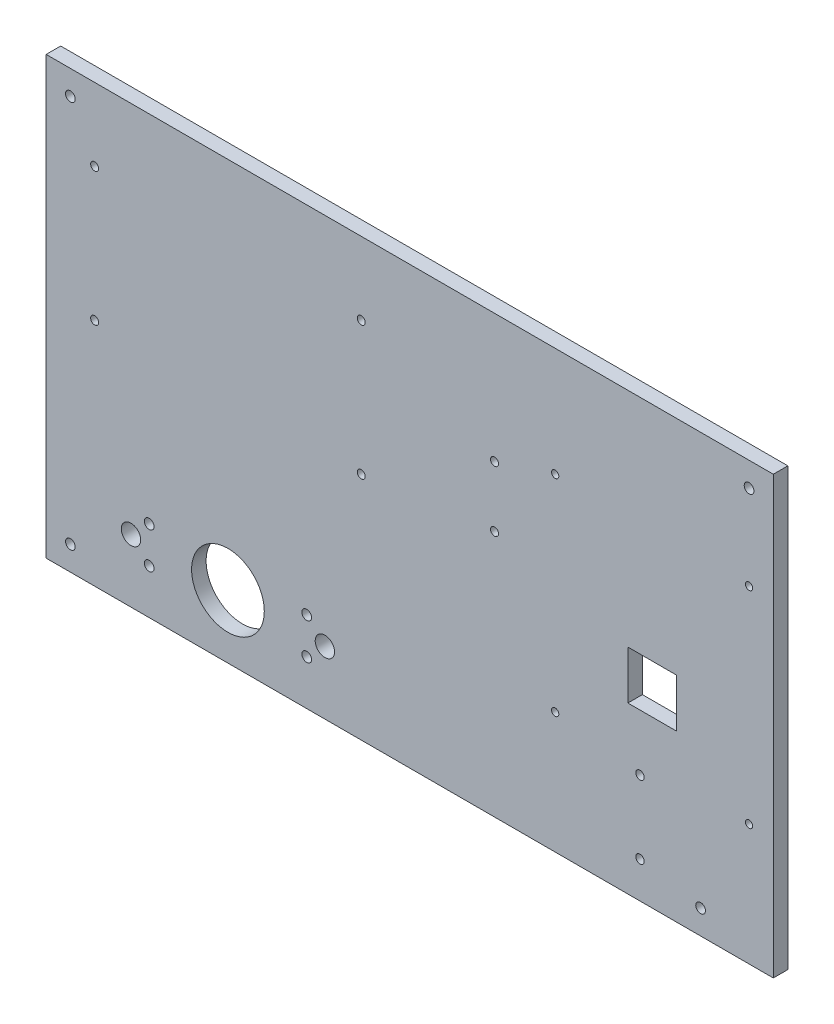
ISO-10303-21;
HEADER;
FILE_DESCRIPTION(('STEP AP214'),'2;1');
FILE_NAME('part.step','',(''),(''),'','','');
FILE_SCHEMA(('AUTOMOTIVE_DESIGN { 1 0 10303 214 1 1 1 1 }'));
ENDSEC;
DATA;
#1=APPLICATION_CONTEXT('core data for automotive mechanical design processes');
#2=APPLICATION_PROTOCOL_DEFINITION('international standard','automotive_design',2000,#1);
#3=PRODUCT_CONTEXT('',#1,'mechanical');
#4=PRODUCT('Part','Part','',(#3));
#5=PRODUCT_RELATED_PRODUCT_CATEGORY('part','',(#4));
#6=PRODUCT_DEFINITION_FORMATION('','',#4);
#7=PRODUCT_DEFINITION_CONTEXT('part definition',#1,'design');
#8=PRODUCT_DEFINITION('design','',#6,#7);
#9=PRODUCT_DEFINITION_SHAPE('','',#8);
#10=(LENGTH_UNIT() NAMED_UNIT(*) SI_UNIT(.MILLI.,.METRE.));
#11=(NAMED_UNIT(*) PLANE_ANGLE_UNIT() SI_UNIT($,.RADIAN.));
#12=(NAMED_UNIT(*) SI_UNIT($,.STERADIAN.) SOLID_ANGLE_UNIT());
#13=UNCERTAINTY_MEASURE_WITH_UNIT(LENGTH_MEASURE(1.E-05),#10,'distance_accuracy_value','');
#14=(GEOMETRIC_REPRESENTATION_CONTEXT(3) GLOBAL_UNCERTAINTY_ASSIGNED_CONTEXT((#13)) GLOBAL_UNIT_ASSIGNED_CONTEXT((#10,
#11,#12)) REPRESENTATION_CONTEXT('',''));
#15=CARTESIAN_POINT('',(0.,0.,0.));
#16=DIRECTION('',(0.,0.,1.));
#17=DIRECTION('',(1.,0.,0.));
#18=AXIS2_PLACEMENT_3D('',#15,#16,#17);
#19=CARTESIAN_POINT('',(0.,-1.75000000000004,6.));
#20=DIRECTION('',(0.,1.,0.));
#21=DIRECTION('',(0.,0.,1.));
#22=AXIS2_PLACEMENT_3D('',#19,#20,#21);
#23=PLANE('',#22);
#24=DIRECTION('',(1.,0.,0.));
#25=VECTOR('',#24,1.);
#26=CARTESIAN_POINT('',(0.,-1.75000000000004,0.));
#27=LINE('',#26,#25);
#28=CARTESIAN_POINT('',(90.,-1.75000000000004,0.));
#29=VERTEX_POINT('',#28);
#30=CARTESIAN_POINT('',(110.,-1.75000000000004,0.));
#31=VERTEX_POINT('',#30);
#32=EDGE_CURVE('E205',#29,#31,#27,.T.);
#33=ORIENTED_EDGE('',*,*,#32,.T.);
#34=DIRECTION('',(0.,0.,-1.));
#35=VECTOR('',#34,1.);
#36=CARTESIAN_POINT('',(110.,-1.75000000000004,6.));
#37=LINE('',#36,#35);
#38=CARTESIAN_POINT('',(110.,-1.75000000000004,6.));
#39=VERTEX_POINT('',#38);
#40=EDGE_CURVE('E11',#39,#31,#37,.T.);
#41=ORIENTED_EDGE('',*,*,#40,.F.);
#42=DIRECTION('',(1.,0.,0.));
#43=VECTOR('',#42,1.);
#44=CARTESIAN_POINT('',(0.,-1.75000000000004,6.));
#45=LINE('',#44,#43);
#46=CARTESIAN_POINT('',(90.,-1.75000000000004,6.));
#47=VERTEX_POINT('',#46);
#48=EDGE_CURVE('E118',#47,#39,#45,.T.);
#49=ORIENTED_EDGE('',*,*,#48,.F.);
#50=DIRECTION('',(0.,0.,-1.));
#51=VECTOR('',#50,1.);
#52=CARTESIAN_POINT('',(90.,-1.75000000000004,6.));
#53=LINE('',#52,#51);
#54=EDGE_CURVE('E56',#47,#29,#53,.T.);
#55=ORIENTED_EDGE('',*,*,#54,.T.);
#56=EDGE_LOOP('',(#33,#41,#49,#55));
#57=FACE_BOUND('',#56,.T.);
#58=ADVANCED_FACE('F37',(#57),#23,.F.);
#59=CARTESIAN_POINT('',(110.,0.,6.));
#60=DIRECTION('',(1.,0.,0.));
#61=DIRECTION('',(0.,0.,-1.));
#62=AXIS2_PLACEMENT_3D('',#59,#60,#61);
#63=PLANE('',#62);
#64=DIRECTION('',(0.,-1.,0.));
#65=VECTOR('',#64,1.);
#66=CARTESIAN_POINT('',(110.,0.,0.));
#67=LINE('',#66,#65);
#68=CARTESIAN_POINT('',(110.,-21.75,0.));
#69=VERTEX_POINT('',#68);
#70=EDGE_CURVE('E124',#31,#69,#67,.T.);
#71=ORIENTED_EDGE('',*,*,#70,.T.);
#72=DIRECTION('',(0.,0.,-1.));
#73=VECTOR('',#72,1.);
#74=CARTESIAN_POINT('',(110.,-21.75,6.));
#75=LINE('',#74,#73);
#76=CARTESIAN_POINT('',(110.,-21.75,6.));
#77=VERTEX_POINT('',#76);
#78=EDGE_CURVE('E47',#77,#69,#75,.T.);
#79=ORIENTED_EDGE('',*,*,#78,.F.);
#80=DIRECTION('',(0.,-1.,0.));
#81=VECTOR('',#80,1.);
#82=CARTESIAN_POINT('',(110.,0.,6.));
#83=LINE('',#82,#81);
#84=EDGE_CURVE('E111',#39,#77,#83,.T.);
#85=ORIENTED_EDGE('',*,*,#84,.F.);
#86=ORIENTED_EDGE('',*,*,#40,.T.);
#87=EDGE_LOOP('',(#71,#79,#85,#86));
#88=FACE_BOUND('',#87,.T.);
#89=ADVANCED_FACE('F123',(#88),#63,.F.);
#90=CARTESIAN_POINT('',(0.,-21.75,6.));
#91=DIRECTION('',(0.,1.,0.));
#92=DIRECTION('',(0.,0.,1.));
#93=AXIS2_PLACEMENT_3D('',#90,#91,#92);
#94=PLANE('',#93);
#95=DIRECTION('',(1.,0.,0.));
#96=VECTOR('',#95,1.);
#97=CARTESIAN_POINT('',(0.,-21.75,0.));
#98=LINE('',#97,#96);
#99=CARTESIAN_POINT('',(90.,-21.75,0.));
#100=VERTEX_POINT('',#99);
#101=EDGE_CURVE('E208',#100,#69,#98,.T.);
#102=ORIENTED_EDGE('',*,*,#101,.F.);
#103=DIRECTION('',(0.,0.,-1.));
#104=VECTOR('',#103,1.);
#105=CARTESIAN_POINT('',(90.,-21.75,6.));
#106=LINE('',#105,#104);
#107=CARTESIAN_POINT('',(90.,-21.75,6.));
#108=VERTEX_POINT('',#107);
#109=EDGE_CURVE('E82',#108,#100,#106,.T.);
#110=ORIENTED_EDGE('',*,*,#109,.F.);
#111=DIRECTION('',(1.,0.,0.));
#112=VECTOR('',#111,1.);
#113=CARTESIAN_POINT('',(0.,-21.75,6.));
#114=LINE('',#113,#112);
#115=EDGE_CURVE('E117',#108,#77,#114,.T.);
#116=ORIENTED_EDGE('',*,*,#115,.T.);
#117=ORIENTED_EDGE('',*,*,#78,.T.);
#118=EDGE_LOOP('',(#102,#110,#116,#117));
#119=FACE_BOUND('',#118,.T.);
#120=ADVANCED_FACE('F128',(#119),#94,.T.);
#121=CARTESIAN_POINT('',(150.,0.,6.));
#122=DIRECTION('',(1.,0.,0.));
#123=DIRECTION('',(0.,1.,0.));
#124=AXIS2_PLACEMENT_3D('',#121,#122,#123);
#125=PLANE('',#124);
#126=DIRECTION('',(0.,-1.,0.));
#127=VECTOR('',#126,1.);
#128=CARTESIAN_POINT('',(150.,0.,0.));
#129=LINE('',#128,#127);
#130=CARTESIAN_POINT('',(150.,89.9999999999999,0.));
#131=VERTEX_POINT('',#130);
#132=CARTESIAN_POINT('',(150.,-89.9999999999999,0.));
#133=VERTEX_POINT('',#132);
#134=EDGE_CURVE('E193',#131,#133,#129,.T.);
#135=ORIENTED_EDGE('',*,*,#134,.F.);
#136=DIRECTION('',(0.,0.,-1.));
#137=VECTOR('',#136,1.);
#138=CARTESIAN_POINT('',(150.,89.9999999999999,6.));
#139=LINE('',#138,#137);
#140=CARTESIAN_POINT('',(150.,89.9999999999999,6.));
#141=VERTEX_POINT('',#140);
#142=EDGE_CURVE('E94',#141,#131,#139,.T.);
#143=ORIENTED_EDGE('',*,*,#142,.F.);
#144=DIRECTION('',(0.,-1.,0.));
#145=VECTOR('',#144,1.);
#146=CARTESIAN_POINT('',(150.,0.,6.));
#147=LINE('',#146,#145);
#148=CARTESIAN_POINT('',(150.,-89.9999999999999,6.));
#149=VERTEX_POINT('',#148);
#150=EDGE_CURVE('E300',#141,#149,#147,.T.);
#151=ORIENTED_EDGE('',*,*,#150,.T.);
#152=DIRECTION('',(0.,0.,-1.));
#153=VECTOR('',#152,1.);
#154=CARTESIAN_POINT('',(150.,-89.9999999999999,6.));
#155=LINE('',#154,#153);
#156=EDGE_CURVE('E137',#149,#133,#155,.T.);
#157=ORIENTED_EDGE('',*,*,#156,.T.);
#158=EDGE_LOOP('',(#135,#143,#151,#157));
#159=FACE_BOUND('',#158,.T.);
#160=ADVANCED_FACE('F316',(#159),#125,.T.);
#161=CARTESIAN_POINT('',(0.,90.,6.));
#162=DIRECTION('',(0.,1.,0.));
#163=DIRECTION('',(-1.,0.,0.));
#164=AXIS2_PLACEMENT_3D('',#161,#162,#163);
#165=PLANE('',#164);
#166=DIRECTION('',(1.,0.,0.));
#167=VECTOR('',#166,1.);
#168=CARTESIAN_POINT('',(0.,90.,0.));
#169=LINE('',#168,#167);
#170=CARTESIAN_POINT('',(-150.,90.,0.));
#171=VERTEX_POINT('',#170);
#172=EDGE_CURVE('E196',#171,#131,#169,.T.);
#173=ORIENTED_EDGE('',*,*,#172,.F.);
#174=DIRECTION('',(0.,0.,-1.));
#175=VECTOR('',#174,1.);
#176=CARTESIAN_POINT('',(-150.,90.,6.));
#177=LINE('',#176,#175);
#178=CARTESIAN_POINT('',(-150.,90.,6.));
#179=VERTEX_POINT('',#178);
#180=EDGE_CURVE('E223',#179,#171,#177,.T.);
#181=ORIENTED_EDGE('',*,*,#180,.F.);
#182=DIRECTION('',(1.,0.,0.));
#183=VECTOR('',#182,1.);
#184=CARTESIAN_POINT('',(0.,90.,6.));
#185=LINE('',#184,#183);
#186=EDGE_CURVE('E302',#179,#141,#185,.T.);
#187=ORIENTED_EDGE('',*,*,#186,.T.);
#188=ORIENTED_EDGE('',*,*,#142,.T.);
#189=EDGE_LOOP('',(#173,#181,#187,#188));
#190=FACE_BOUND('',#189,.T.);
#191=ADVANCED_FACE('F318',(#190),#165,.T.);
#192=CARTESIAN_POINT('',(-150.,0.,6.));
#193=DIRECTION('',(1.,0.,0.));
#194=DIRECTION('',(0.,1.,0.));
#195=AXIS2_PLACEMENT_3D('',#192,#193,#194);
#196=PLANE('',#195);
#197=DIRECTION('',(0.,-1.,0.));
#198=VECTOR('',#197,1.);
#199=CARTESIAN_POINT('',(-150.,0.,0.));
#200=LINE('',#199,#198);
#201=CARTESIAN_POINT('',(-150.,-90.,0.));
#202=VERTEX_POINT('',#201);
#203=EDGE_CURVE('E199',#171,#202,#200,.T.);
#204=ORIENTED_EDGE('',*,*,#203,.T.);
#205=DIRECTION('',(0.,0.,-1.));
#206=VECTOR('',#205,1.);
#207=CARTESIAN_POINT('',(-150.,-90.,6.));
#208=LINE('',#207,#206);
#209=CARTESIAN_POINT('',(-150.,-90.,6.));
#210=VERTEX_POINT('',#209);
#211=EDGE_CURVE('E220',#210,#202,#208,.T.);
#212=ORIENTED_EDGE('',*,*,#211,.F.);
#213=DIRECTION('',(0.,-1.,0.));
#214=VECTOR('',#213,1.);
#215=CARTESIAN_POINT('',(-150.,0.,6.));
#216=LINE('',#215,#214);
#217=EDGE_CURVE('E305',#179,#210,#216,.T.);
#218=ORIENTED_EDGE('',*,*,#217,.F.);
#219=ORIENTED_EDGE('',*,*,#180,.T.);
#220=EDGE_LOOP('',(#204,#212,#218,#219));
#221=FACE_BOUND('',#220,.T.);
#222=ADVANCED_FACE('F324',(#221),#196,.F.);
#223=CARTESIAN_POINT('',(90.,0.,6.));
#224=DIRECTION('',(1.,0.,0.));
#225=DIRECTION('',(0.,0.,-1.));
#226=AXIS2_PLACEMENT_3D('',#223,#224,#225);
#227=PLANE('',#226);
#228=DIRECTION('',(0.,-1.,0.));
#229=VECTOR('',#228,1.);
#230=CARTESIAN_POINT('',(90.,0.,0.));
#231=LINE('',#230,#229);
#232=EDGE_CURVE('E210',#29,#100,#231,.T.);
#233=ORIENTED_EDGE('',*,*,#232,.F.);
#234=ORIENTED_EDGE('',*,*,#54,.F.);
#235=DIRECTION('',(0.,-1.,0.));
#236=VECTOR('',#235,1.);
#237=CARTESIAN_POINT('',(90.,0.,6.));
#238=LINE('',#237,#236);
#239=EDGE_CURVE('E129',#47,#108,#238,.T.);
#240=ORIENTED_EDGE('',*,*,#239,.T.);
#241=ORIENTED_EDGE('',*,*,#109,.T.);
#242=EDGE_LOOP('',(#233,#234,#240,#241));
#243=FACE_BOUND('',#242,.T.);
#244=ADVANCED_FACE('F339',(#243),#227,.T.);
#245=CARTESIAN_POINT('',(0.,-90.,6.));
#246=DIRECTION('',(0.,1.,0.));
#247=DIRECTION('',(-1.,0.,0.));
#248=AXIS2_PLACEMENT_3D('',#245,#246,#247);
#249=PLANE('',#248);
#250=DIRECTION('',(1.,0.,0.));
#251=VECTOR('',#250,1.);
#252=CARTESIAN_POINT('',(0.,-90.,0.));
#253=LINE('',#252,#251);
#254=EDGE_CURVE('E202',#202,#133,#253,.T.);
#255=ORIENTED_EDGE('',*,*,#254,.T.);
#256=ORIENTED_EDGE('',*,*,#156,.F.);
#257=DIRECTION('',(1.,0.,0.));
#258=VECTOR('',#257,1.);
#259=CARTESIAN_POINT('',(0.,-90.,6.));
#260=LINE('',#259,#258);
#261=EDGE_CURVE('E308',#210,#149,#260,.T.);
#262=ORIENTED_EDGE('',*,*,#261,.F.);
#263=ORIENTED_EDGE('',*,*,#211,.T.);
#264=EDGE_LOOP('',(#255,#256,#262,#263));
#265=FACE_BOUND('',#264,.T.);
#266=ADVANCED_FACE('F315',(#265),#249,.F.);
#267=CARTESIAN_POINT('',(140.,45.,6.));
#268=DIRECTION('',(0.,0.,-1.));
#269=DIRECTION('',(-1.,0.,0.));
#270=AXIS2_PLACEMENT_3D('',#267,#268,#269);
#271=CYLINDRICAL_SURFACE('',#270,1.5);
#272=CARTESIAN_POINT('',(140.,45.,6.));
#273=DIRECTION('',(0.,0.,1.));
#274=DIRECTION('',(1.,0.,0.));
#275=AXIS2_PLACEMENT_3D('',#272,#273,#274);
#276=CIRCLE('',#275,1.5);
#277=CARTESIAN_POINT('',(141.5,45.,6.));
#278=VERTEX_POINT('',#277);
#279=EDGE_CURVE('E297',#278,#278,#276,.T.);
#280=ORIENTED_EDGE('',*,*,#279,.T.);
#281=EDGE_LOOP('',(#280));
#282=FACE_BOUND('',#281,.T.);
#283=CARTESIAN_POINT('',(140.,45.,0.));
#284=DIRECTION('',(0.,0.,1.));
#285=DIRECTION('',(1.,0.,0.));
#286=AXIS2_PLACEMENT_3D('',#283,#284,#285);
#287=CIRCLE('',#286,1.5);
#288=CARTESIAN_POINT('',(141.5,45.,0.));
#289=VERTEX_POINT('',#288);
#290=EDGE_CURVE('E190',#289,#289,#287,.T.);
#291=ORIENTED_EDGE('',*,*,#290,.F.);
#292=EDGE_LOOP('',(#291));
#293=FACE_BOUND('',#292,.T.);
#294=ADVANCED_FACE('F338',(#282,#293),#271,.F.);
#295=CARTESIAN_POINT('',(140.,-40.,6.));
#296=DIRECTION('',(0.,0.,-1.));
#297=DIRECTION('',(-1.,0.,0.));
#298=AXIS2_PLACEMENT_3D('',#295,#296,#297);
#299=CYLINDRICAL_SURFACE('',#298,1.5);
#300=CARTESIAN_POINT('',(140.,-40.,6.));
#301=DIRECTION('',(0.,0.,1.));
#302=DIRECTION('',(1.,0.,0.));
#303=AXIS2_PLACEMENT_3D('',#300,#301,#302);
#304=CIRCLE('',#303,1.5);
#305=CARTESIAN_POINT('',(141.5,-40.,6.));
#306=VERTEX_POINT('',#305);
#307=EDGE_CURVE('E294',#306,#306,#304,.F.);
#308=ORIENTED_EDGE('',*,*,#307,.F.);
#309=EDGE_LOOP('',(#308));
#310=FACE_BOUND('',#309,.T.);
#311=CARTESIAN_POINT('',(140.,-40.,0.));
#312=DIRECTION('',(0.,0.,1.));
#313=DIRECTION('',(1.,0.,0.));
#314=AXIS2_PLACEMENT_3D('',#311,#312,#313);
#315=CIRCLE('',#314,1.5);
#316=CARTESIAN_POINT('',(141.5,-40.,0.));
#317=VERTEX_POINT('',#316);
#318=EDGE_CURVE('E187',#317,#317,#315,.F.);
#319=ORIENTED_EDGE('',*,*,#318,.T.);
#320=EDGE_LOOP('',(#319));
#321=FACE_BOUND('',#320,.T.);
#322=ADVANCED_FACE('F437',(#310,#321),#299,.F.);
#323=CARTESIAN_POINT('',(60.,45.,6.));
#324=DIRECTION('',(0.,0.,-1.));
#325=DIRECTION('',(-1.,0.,0.));
#326=AXIS2_PLACEMENT_3D('',#323,#324,#325);
#327=CYLINDRICAL_SURFACE('',#326,1.5);
#328=CARTESIAN_POINT('',(60.,45.,6.));
#329=DIRECTION('',(0.,0.,1.));
#330=DIRECTION('',(1.,0.,0.));
#331=AXIS2_PLACEMENT_3D('',#328,#329,#330);
#332=CIRCLE('',#331,1.5);
#333=CARTESIAN_POINT('',(61.5,45.,6.));
#334=VERTEX_POINT('',#333);
#335=EDGE_CURVE('E291',#334,#334,#332,.T.);
#336=ORIENTED_EDGE('',*,*,#335,.T.);
#337=EDGE_LOOP('',(#336));
#338=FACE_BOUND('',#337,.T.);
#339=CARTESIAN_POINT('',(60.,45.,0.));
#340=DIRECTION('',(0.,0.,1.));
#341=DIRECTION('',(1.,0.,0.));
#342=AXIS2_PLACEMENT_3D('',#339,#340,#341);
#343=CIRCLE('',#342,1.5);
#344=CARTESIAN_POINT('',(61.5,45.,0.));
#345=VERTEX_POINT('',#344);
#346=EDGE_CURVE('E184',#345,#345,#343,.T.);
#347=ORIENTED_EDGE('',*,*,#346,.F.);
#348=EDGE_LOOP('',(#347));
#349=FACE_BOUND('',#348,.T.);
#350=ADVANCED_FACE('F443',(#338,#349),#327,.F.);
#351=CARTESIAN_POINT('',(-107.5,-56.5,6.));
#352=DIRECTION('',(0.,0.,-1.));
#353=DIRECTION('',(-1.,0.,0.));
#354=AXIS2_PLACEMENT_3D('',#351,#352,#353);
#355=CYLINDRICAL_SURFACE('',#354,2.);
#356=CARTESIAN_POINT('',(-107.5,-56.5,6.));
#357=DIRECTION('',(0.,0.,1.));
#358=DIRECTION('',(1.,0.,0.));
#359=AXIS2_PLACEMENT_3D('',#356,#357,#358);
#360=CIRCLE('',#359,2.);
#361=CARTESIAN_POINT('',(-105.5,-56.5,6.));
#362=VERTEX_POINT('',#361);
#363=EDGE_CURVE('E288',#362,#362,#360,.T.);
#364=ORIENTED_EDGE('',*,*,#363,.T.);
#365=EDGE_LOOP('',(#364));
#366=FACE_BOUND('',#365,.T.);
#367=CARTESIAN_POINT('',(-107.5,-56.5,0.));
#368=DIRECTION('',(0.,0.,1.));
#369=DIRECTION('',(1.,0.,0.));
#370=AXIS2_PLACEMENT_3D('',#367,#368,#369);
#371=CIRCLE('',#370,2.);
#372=CARTESIAN_POINT('',(-105.5,-56.5,0.));
#373=VERTEX_POINT('',#372);
#374=EDGE_CURVE('E181',#373,#373,#371,.T.);
#375=ORIENTED_EDGE('',*,*,#374,.F.);
#376=EDGE_LOOP('',(#375));
#377=FACE_BOUND('',#376,.T.);
#378=ADVANCED_FACE('F449',(#366,#377),#355,.F.);
#379=CARTESIAN_POINT('',(-42.4999999999999,-56.5,6.));
#380=DIRECTION('',(0.,0.,-1.));
#381=DIRECTION('',(-1.,0.,0.));
#382=AXIS2_PLACEMENT_3D('',#379,#380,#381);
#383=CYLINDRICAL_SURFACE('',#382,2.);
#384=CARTESIAN_POINT('',(-42.4999999999999,-56.5,6.));
#385=DIRECTION('',(0.,0.,1.));
#386=DIRECTION('',(1.,0.,0.));
#387=AXIS2_PLACEMENT_3D('',#384,#385,#386);
#388=CIRCLE('',#387,2.);
#389=CARTESIAN_POINT('',(-40.4999999999999,-56.5,6.));
#390=VERTEX_POINT('',#389);
#391=EDGE_CURVE('E285',#390,#390,#388,.T.);
#392=ORIENTED_EDGE('',*,*,#391,.T.);
#393=EDGE_LOOP('',(#392));
#394=FACE_BOUND('',#393,.T.);
#395=CARTESIAN_POINT('',(-42.4999999999999,-56.5,0.));
#396=DIRECTION('',(0.,0.,1.));
#397=DIRECTION('',(1.,0.,0.));
#398=AXIS2_PLACEMENT_3D('',#395,#396,#397);
#399=CIRCLE('',#398,2.);
#400=CARTESIAN_POINT('',(-40.4999999999999,-56.5,0.));
#401=VERTEX_POINT('',#400);
#402=EDGE_CURVE('E178',#401,#401,#399,.T.);
#403=ORIENTED_EDGE('',*,*,#402,.F.);
#404=EDGE_LOOP('',(#403));
#405=FACE_BOUND('',#404,.T.);
#406=ADVANCED_FACE('F453',(#394,#405),#383,.F.);
#407=CARTESIAN_POINT('',(-74.9999999999999,-64.,6.));
#408=DIRECTION('',(0.,0.,-1.));
#409=DIRECTION('',(-1.,0.,0.));
#410=AXIS2_PLACEMENT_3D('',#407,#408,#409);
#411=CYLINDRICAL_SURFACE('',#410,15.);
#412=CARTESIAN_POINT('',(-74.9999999999999,-64.,6.));
#413=DIRECTION('',(0.,0.,1.));
#414=DIRECTION('',(1.,0.,0.));
#415=AXIS2_PLACEMENT_3D('',#412,#413,#414);
#416=CIRCLE('',#415,15.);
#417=CARTESIAN_POINT('',(-59.9999999999999,-64.,6.));
#418=VERTEX_POINT('',#417);
#419=EDGE_CURVE('E282',#418,#418,#416,.T.);
#420=ORIENTED_EDGE('',*,*,#419,.T.);
#421=EDGE_LOOP('',(#420));
#422=FACE_BOUND('',#421,.T.);
#423=CARTESIAN_POINT('',(-74.9999999999999,-64.,0.));
#424=DIRECTION('',(0.,0.,1.));
#425=DIRECTION('',(1.,0.,0.));
#426=AXIS2_PLACEMENT_3D('',#423,#424,#425);
#427=CIRCLE('',#426,15.);
#428=CARTESIAN_POINT('',(-59.9999999999999,-64.,0.));
#429=VERTEX_POINT('',#428);
#430=EDGE_CURVE('E175',#429,#429,#427,.T.);
#431=ORIENTED_EDGE('',*,*,#430,.F.);
#432=EDGE_LOOP('',(#431));
#433=FACE_BOUND('',#432,.T.);
#434=ADVANCED_FACE('F457',(#422,#433),#411,.F.);
#435=CARTESIAN_POINT('',(-34.9999999999999,-64.,6.));
#436=DIRECTION('',(0.,0.,-1.));
#437=DIRECTION('',(-1.,0.,0.));
#438=AXIS2_PLACEMENT_3D('',#435,#436,#437);
#439=CYLINDRICAL_SURFACE('',#438,4.);
#440=CARTESIAN_POINT('',(-34.9999999999999,-64.,6.));
#441=DIRECTION('',(0.,0.,1.));
#442=DIRECTION('',(1.,0.,0.));
#443=AXIS2_PLACEMENT_3D('',#440,#441,#442);
#444=CIRCLE('',#443,4.);
#445=CARTESIAN_POINT('',(-30.9999999999999,-64.,6.));
#446=VERTEX_POINT('',#445);
#447=EDGE_CURVE('E279',#446,#446,#444,.T.);
#448=ORIENTED_EDGE('',*,*,#447,.T.);
#449=EDGE_LOOP('',(#448));
#450=FACE_BOUND('',#449,.T.);
#451=CARTESIAN_POINT('',(-34.9999999999999,-64.,0.));
#452=DIRECTION('',(0.,0.,1.));
#453=DIRECTION('',(1.,0.,0.));
#454=AXIS2_PLACEMENT_3D('',#451,#452,#453);
#455=CIRCLE('',#454,4.);
#456=CARTESIAN_POINT('',(-30.9999999999999,-64.,0.));
#457=VERTEX_POINT('',#456);
#458=EDGE_CURVE('E172',#457,#457,#455,.T.);
#459=ORIENTED_EDGE('',*,*,#458,.F.);
#460=EDGE_LOOP('',(#459));
#461=FACE_BOUND('',#460,.T.);
#462=ADVANCED_FACE('F461',(#450,#461),#439,.F.);
#463=CARTESIAN_POINT('',(-115.,-64.0000000000001,6.));
#464=DIRECTION('',(0.,0.,-1.));
#465=DIRECTION('',(-1.,0.,0.));
#466=AXIS2_PLACEMENT_3D('',#463,#464,#465);
#467=CYLINDRICAL_SURFACE('',#466,4.00000000000001);
#468=CARTESIAN_POINT('',(-115.,-64.0000000000001,6.));
#469=DIRECTION('',(0.,0.,1.));
#470=DIRECTION('',(1.,0.,0.));
#471=AXIS2_PLACEMENT_3D('',#468,#469,#470);
#472=CIRCLE('',#471,4.00000000000001);
#473=CARTESIAN_POINT('',(-111.,-64.0000000000001,6.));
#474=VERTEX_POINT('',#473);
#475=EDGE_CURVE('E276',#474,#474,#472,.T.);
#476=ORIENTED_EDGE('',*,*,#475,.T.);
#477=EDGE_LOOP('',(#476));
#478=FACE_BOUND('',#477,.T.);
#479=CARTESIAN_POINT('',(-115.,-64.0000000000001,0.));
#480=DIRECTION('',(0.,0.,1.));
#481=DIRECTION('',(1.,0.,0.));
#482=AXIS2_PLACEMENT_3D('',#479,#480,#481);
#483=CIRCLE('',#482,4.00000000000001);
#484=CARTESIAN_POINT('',(-111.,-64.0000000000001,0.));
#485=VERTEX_POINT('',#484);
#486=EDGE_CURVE('E169',#485,#485,#483,.T.);
#487=ORIENTED_EDGE('',*,*,#486,.F.);
#488=EDGE_LOOP('',(#487));
#489=FACE_BOUND('',#488,.T.);
#490=ADVANCED_FACE('F465',(#478,#489),#467,.F.);
#491=CARTESIAN_POINT('',(-42.4999999999999,-71.5,6.));
#492=DIRECTION('',(0.,0.,-1.));
#493=DIRECTION('',(-1.,0.,0.));
#494=AXIS2_PLACEMENT_3D('',#491,#492,#493);
#495=CYLINDRICAL_SURFACE('',#494,2.);
#496=CARTESIAN_POINT('',(-42.4999999999999,-71.5,6.));
#497=DIRECTION('',(0.,0.,1.));
#498=DIRECTION('',(1.,0.,0.));
#499=AXIS2_PLACEMENT_3D('',#496,#497,#498);
#500=CIRCLE('',#499,2.);
#501=CARTESIAN_POINT('',(-40.4999999999999,-71.5,6.));
#502=VERTEX_POINT('',#501);
#503=EDGE_CURVE('E273',#502,#502,#500,.T.);
#504=ORIENTED_EDGE('',*,*,#503,.T.);
#505=EDGE_LOOP('',(#504));
#506=FACE_BOUND('',#505,.T.);
#507=CARTESIAN_POINT('',(-42.4999999999999,-71.5,0.));
#508=DIRECTION('',(0.,0.,1.));
#509=DIRECTION('',(1.,0.,0.));
#510=AXIS2_PLACEMENT_3D('',#507,#508,#509);
#511=CIRCLE('',#510,2.);
#512=CARTESIAN_POINT('',(-40.4999999999999,-71.5,0.));
#513=VERTEX_POINT('',#512);
#514=EDGE_CURVE('E166',#513,#513,#511,.T.);
#515=ORIENTED_EDGE('',*,*,#514,.F.);
#516=EDGE_LOOP('',(#515));
#517=FACE_BOUND('',#516,.T.);
#518=ADVANCED_FACE('F469',(#506,#517),#495,.F.);
#519=CARTESIAN_POINT('',(-107.5,-71.5,6.));
#520=DIRECTION('',(0.,0.,-1.));
#521=DIRECTION('',(-1.,0.,0.));
#522=AXIS2_PLACEMENT_3D('',#519,#520,#521);
#523=CYLINDRICAL_SURFACE('',#522,2.);
#524=CARTESIAN_POINT('',(-107.5,-71.5,6.));
#525=DIRECTION('',(0.,0.,1.));
#526=DIRECTION('',(1.,0.,0.));
#527=AXIS2_PLACEMENT_3D('',#524,#525,#526);
#528=CIRCLE('',#527,2.);
#529=CARTESIAN_POINT('',(-105.5,-71.5,6.));
#530=VERTEX_POINT('',#529);
#531=EDGE_CURVE('E270',#530,#530,#528,.T.);
#532=ORIENTED_EDGE('',*,*,#531,.T.);
#533=EDGE_LOOP('',(#532));
#534=FACE_BOUND('',#533,.T.);
#535=CARTESIAN_POINT('',(-107.5,-71.5,0.));
#536=DIRECTION('',(0.,0.,1.));
#537=DIRECTION('',(1.,0.,0.));
#538=AXIS2_PLACEMENT_3D('',#535,#536,#537);
#539=CIRCLE('',#538,2.);
#540=CARTESIAN_POINT('',(-105.5,-71.5,0.));
#541=VERTEX_POINT('',#540);
#542=EDGE_CURVE('E163',#541,#541,#539,.T.);
#543=ORIENTED_EDGE('',*,*,#542,.F.);
#544=EDGE_LOOP('',(#543));
#545=FACE_BOUND('',#544,.T.);
#546=ADVANCED_FACE('F473',(#534,#545),#523,.F.);
#547=CARTESIAN_POINT('',(35.,37.,6.));
#548=DIRECTION('',(0.,0.,-1.));
#549=DIRECTION('',(-1.,0.,0.));
#550=AXIS2_PLACEMENT_3D('',#547,#548,#549);
#551=CYLINDRICAL_SURFACE('',#550,1.65);
#552=CARTESIAN_POINT('',(35.,37.,6.));
#553=DIRECTION('',(0.,0.,1.));
#554=DIRECTION('',(1.,0.,0.));
#555=AXIS2_PLACEMENT_3D('',#552,#553,#554);
#556=CIRCLE('',#555,1.65);
#557=CARTESIAN_POINT('',(36.65,37.,6.));
#558=VERTEX_POINT('',#557);
#559=EDGE_CURVE('E267',#558,#558,#556,.T.);
#560=ORIENTED_EDGE('',*,*,#559,.T.);
#561=EDGE_LOOP('',(#560));
#562=FACE_BOUND('',#561,.T.);
#563=CARTESIAN_POINT('',(35.,37.,0.));
#564=DIRECTION('',(0.,0.,1.));
#565=DIRECTION('',(1.,0.,0.));
#566=AXIS2_PLACEMENT_3D('',#563,#564,#565);
#567=CIRCLE('',#566,1.65);
#568=CARTESIAN_POINT('',(36.65,37.,0.));
#569=VERTEX_POINT('',#568);
#570=EDGE_CURVE('E160',#569,#569,#567,.T.);
#571=ORIENTED_EDGE('',*,*,#570,.F.);
#572=EDGE_LOOP('',(#571));
#573=FACE_BOUND('',#572,.T.);
#574=ADVANCED_FACE('F477',(#562,#573),#551,.F.);
#575=CARTESIAN_POINT('',(35.,12.,6.));
#576=DIRECTION('',(0.,0.,-1.));
#577=DIRECTION('',(-1.,0.,0.));
#578=AXIS2_PLACEMENT_3D('',#575,#576,#577);
#579=CYLINDRICAL_SURFACE('',#578,1.64999999999999);
#580=CARTESIAN_POINT('',(35.,12.,6.));
#581=DIRECTION('',(0.,0.,1.));
#582=DIRECTION('',(1.,0.,0.));
#583=AXIS2_PLACEMENT_3D('',#580,#581,#582);
#584=CIRCLE('',#583,1.64999999999999);
#585=CARTESIAN_POINT('',(36.65,12.,6.));
#586=VERTEX_POINT('',#585);
#587=EDGE_CURVE('E264',#586,#586,#584,.T.);
#588=ORIENTED_EDGE('',*,*,#587,.T.);
#589=EDGE_LOOP('',(#588));
#590=FACE_BOUND('',#589,.T.);
#591=CARTESIAN_POINT('',(35.,12.,0.));
#592=DIRECTION('',(0.,0.,1.));
#593=DIRECTION('',(1.,0.,0.));
#594=AXIS2_PLACEMENT_3D('',#591,#592,#593);
#595=CIRCLE('',#594,1.64999999999999);
#596=CARTESIAN_POINT('',(36.65,12.,0.));
#597=VERTEX_POINT('',#596);
#598=EDGE_CURVE('E157',#597,#597,#595,.T.);
#599=ORIENTED_EDGE('',*,*,#598,.F.);
#600=EDGE_LOOP('',(#599));
#601=FACE_BOUND('',#600,.T.);
#602=ADVANCED_FACE('F481',(#590,#601),#579,.F.);
#603=CARTESIAN_POINT('',(-130.,59.9999999999999,6.));
#604=DIRECTION('',(0.,0.,-1.));
#605=DIRECTION('',(-1.,0.,0.));
#606=AXIS2_PLACEMENT_3D('',#603,#604,#605);
#607=CYLINDRICAL_SURFACE('',#606,1.64999999999999);
#608=CARTESIAN_POINT('',(-130.,59.9999999999999,6.));
#609=DIRECTION('',(0.,0.,1.));
#610=DIRECTION('',(1.,0.,0.));
#611=AXIS2_PLACEMENT_3D('',#608,#609,#610);
#612=CIRCLE('',#611,1.64999999999999);
#613=CARTESIAN_POINT('',(-128.35,59.9999999999999,6.));
#614=VERTEX_POINT('',#613);
#615=EDGE_CURVE('E261',#614,#614,#612,.T.);
#616=ORIENTED_EDGE('',*,*,#615,.T.);
#617=EDGE_LOOP('',(#616));
#618=FACE_BOUND('',#617,.T.);
#619=CARTESIAN_POINT('',(-130.,59.9999999999999,0.));
#620=DIRECTION('',(0.,0.,1.));
#621=DIRECTION('',(1.,0.,0.));
#622=AXIS2_PLACEMENT_3D('',#619,#620,#621);
#623=CIRCLE('',#622,1.64999999999999);
#624=CARTESIAN_POINT('',(-128.35,59.9999999999999,0.));
#625=VERTEX_POINT('',#624);
#626=EDGE_CURVE('E154',#625,#625,#623,.T.);
#627=ORIENTED_EDGE('',*,*,#626,.F.);
#628=EDGE_LOOP('',(#627));
#629=FACE_BOUND('',#628,.T.);
#630=ADVANCED_FACE('F485',(#618,#629),#607,.F.);
#631=CARTESIAN_POINT('',(-20.0000000000001,60.,6.));
#632=DIRECTION('',(0.,0.,-1.));
#633=DIRECTION('',(-1.,0.,0.));
#634=AXIS2_PLACEMENT_3D('',#631,#632,#633);
#635=CYLINDRICAL_SURFACE('',#634,1.65000000000003);
#636=CARTESIAN_POINT('',(-20.0000000000001,60.,6.));
#637=DIRECTION('',(0.,0.,1.));
#638=DIRECTION('',(1.,0.,0.));
#639=AXIS2_PLACEMENT_3D('',#636,#637,#638);
#640=CIRCLE('',#639,1.65000000000003);
#641=CARTESIAN_POINT('',(-18.35,60.,6.));
#642=VERTEX_POINT('',#641);
#643=EDGE_CURVE('E258',#642,#642,#640,.T.);
#644=ORIENTED_EDGE('',*,*,#643,.T.);
#645=EDGE_LOOP('',(#644));
#646=FACE_BOUND('',#645,.T.);
#647=CARTESIAN_POINT('',(-20.0000000000001,60.,0.));
#648=DIRECTION('',(0.,0.,1.));
#649=DIRECTION('',(1.,0.,0.));
#650=AXIS2_PLACEMENT_3D('',#647,#648,#649);
#651=CIRCLE('',#650,1.65000000000003);
#652=CARTESIAN_POINT('',(-18.35,60.,0.));
#653=VERTEX_POINT('',#652);
#654=EDGE_CURVE('E151',#653,#653,#651,.T.);
#655=ORIENTED_EDGE('',*,*,#654,.F.);
#656=EDGE_LOOP('',(#655));
#657=FACE_BOUND('',#656,.T.);
#658=ADVANCED_FACE('F489',(#646,#657),#635,.F.);
#659=CARTESIAN_POINT('',(-20.,4.99999999999996,6.));
#660=DIRECTION('',(0.,0.,-1.));
#661=DIRECTION('',(-1.,0.,0.));
#662=AXIS2_PLACEMENT_3D('',#659,#660,#661);
#663=CYLINDRICAL_SURFACE('',#662,1.65000000000001);
#664=CARTESIAN_POINT('',(-20.,4.99999999999996,6.));
#665=DIRECTION('',(0.,0.,1.));
#666=DIRECTION('',(1.,0.,0.));
#667=AXIS2_PLACEMENT_3D('',#664,#665,#666);
#668=CIRCLE('',#667,1.65000000000001);
#669=CARTESIAN_POINT('',(-18.35,4.99999999999996,6.));
#670=VERTEX_POINT('',#669);
#671=EDGE_CURVE('E255',#670,#670,#668,.T.);
#672=ORIENTED_EDGE('',*,*,#671,.T.);
#673=EDGE_LOOP('',(#672));
#674=FACE_BOUND('',#673,.T.);
#675=CARTESIAN_POINT('',(-20.,4.99999999999996,0.));
#676=DIRECTION('',(0.,0.,1.));
#677=DIRECTION('',(1.,0.,0.));
#678=AXIS2_PLACEMENT_3D('',#675,#676,#677);
#679=CIRCLE('',#678,1.65000000000001);
#680=CARTESIAN_POINT('',(-18.35,4.99999999999996,0.));
#681=VERTEX_POINT('',#680);
#682=EDGE_CURVE('E148',#681,#681,#679,.T.);
#683=ORIENTED_EDGE('',*,*,#682,.F.);
#684=EDGE_LOOP('',(#683));
#685=FACE_BOUND('',#684,.T.);
#686=ADVANCED_FACE('F493',(#674,#685),#663,.F.);
#687=CARTESIAN_POINT('',(-130.,4.99999999999994,6.));
#688=DIRECTION('',(0.,0.,-1.));
#689=DIRECTION('',(-1.,0.,0.));
#690=AXIS2_PLACEMENT_3D('',#687,#688,#689);
#691=CYLINDRICAL_SURFACE('',#690,1.65000000000001);
#692=CARTESIAN_POINT('',(-130.,4.99999999999994,6.));
#693=DIRECTION('',(0.,0.,1.));
#694=DIRECTION('',(1.,0.,0.));
#695=AXIS2_PLACEMENT_3D('',#692,#693,#694);
#696=CIRCLE('',#695,1.65000000000001);
#697=CARTESIAN_POINT('',(-128.35,4.99999999999994,6.));
#698=VERTEX_POINT('',#697);
#699=EDGE_CURVE('E252',#698,#698,#696,.T.);
#700=ORIENTED_EDGE('',*,*,#699,.T.);
#701=EDGE_LOOP('',(#700));
#702=FACE_BOUND('',#701,.T.);
#703=CARTESIAN_POINT('',(-130.,4.99999999999994,0.));
#704=DIRECTION('',(0.,0.,1.));
#705=DIRECTION('',(1.,0.,0.));
#706=AXIS2_PLACEMENT_3D('',#703,#704,#705);
#707=CIRCLE('',#706,1.65000000000001);
#708=CARTESIAN_POINT('',(-128.35,4.99999999999994,0.));
#709=VERTEX_POINT('',#708);
#710=EDGE_CURVE('E145',#709,#709,#707,.T.);
#711=ORIENTED_EDGE('',*,*,#710,.F.);
#712=EDGE_LOOP('',(#711));
#713=FACE_BOUND('',#712,.T.);
#714=ADVANCED_FACE('F497',(#702,#713),#691,.F.);
#715=CARTESIAN_POINT('',(95.,-45.,6.));
#716=DIRECTION('',(0.,0.,-1.));
#717=DIRECTION('',(-1.,0.,0.));
#718=AXIS2_PLACEMENT_3D('',#715,#716,#717);
#719=CYLINDRICAL_SURFACE('',#718,1.75);
#720=CARTESIAN_POINT('',(95.,-45.,6.));
#721=DIRECTION('',(0.,0.,1.));
#722=DIRECTION('',(1.,0.,0.));
#723=AXIS2_PLACEMENT_3D('',#720,#721,#722);
#724=CIRCLE('',#723,1.75);
#725=CARTESIAN_POINT('',(96.75,-45.,6.));
#726=VERTEX_POINT('',#725);
#727=EDGE_CURVE('E249',#726,#726,#724,.T.);
#728=ORIENTED_EDGE('',*,*,#727,.T.);
#729=EDGE_LOOP('',(#728));
#730=FACE_BOUND('',#729,.T.);
#731=CARTESIAN_POINT('',(95.,-45.,0.));
#732=DIRECTION('',(0.,0.,1.));
#733=DIRECTION('',(1.,0.,0.));
#734=AXIS2_PLACEMENT_3D('',#731,#732,#733);
#735=CIRCLE('',#734,1.75);
#736=CARTESIAN_POINT('',(96.75,-45.,0.));
#737=VERTEX_POINT('',#736);
#738=EDGE_CURVE('E141',#737,#737,#735,.T.);
#739=ORIENTED_EDGE('',*,*,#738,.F.);
#740=EDGE_LOOP('',(#739));
#741=FACE_BOUND('',#740,.T.);
#742=ADVANCED_FACE('F367',(#730,#741),#719,.F.);
#743=CARTESIAN_POINT('',(95.,-75.,6.));
#744=DIRECTION('',(0.,0.,-1.));
#745=DIRECTION('',(-1.,0.,0.));
#746=AXIS2_PLACEMENT_3D('',#743,#744,#745);
#747=CYLINDRICAL_SURFACE('',#746,1.75);
#748=CARTESIAN_POINT('',(95.,-75.,6.));
#749=DIRECTION('',(0.,0.,1.));
#750=DIRECTION('',(1.,0.,0.));
#751=AXIS2_PLACEMENT_3D('',#748,#749,#750);
#752=CIRCLE('',#751,1.75);
#753=CARTESIAN_POINT('',(96.75,-75.,6.));
#754=VERTEX_POINT('',#753);
#755=EDGE_CURVE('E216',#754,#754,#752,.T.);
#756=ORIENTED_EDGE('',*,*,#755,.T.);
#757=EDGE_LOOP('',(#756));
#758=FACE_BOUND('',#757,.T.);
#759=CARTESIAN_POINT('',(95.,-75.,0.));
#760=DIRECTION('',(0.,0.,1.));
#761=DIRECTION('',(1.,0.,0.));
#762=AXIS2_PLACEMENT_3D('',#759,#760,#761);
#763=CIRCLE('',#762,1.75);
#764=CARTESIAN_POINT('',(96.75,-75.,0.));
#765=VERTEX_POINT('',#764);
#766=EDGE_CURVE('E138',#765,#765,#763,.T.);
#767=ORIENTED_EDGE('',*,*,#766,.F.);
#768=EDGE_LOOP('',(#767));
#769=FACE_BOUND('',#768,.T.);
#770=ADVANCED_FACE('F39',(#758,#769),#747,.F.);
#771=CARTESIAN_POINT('',(60.,-40.,6.));
#772=DIRECTION('',(0.,0.,-1.));
#773=DIRECTION('',(-1.,0.,0.));
#774=AXIS2_PLACEMENT_3D('',#771,#772,#773);
#775=CYLINDRICAL_SURFACE('',#774,1.5);
#776=CARTESIAN_POINT('',(60.,-40.,6.));
#777=DIRECTION('',(0.,0.,1.));
#778=DIRECTION('',(1.,0.,0.));
#779=AXIS2_PLACEMENT_3D('',#776,#777,#778);
#780=CIRCLE('',#779,1.5);
#781=CARTESIAN_POINT('',(61.5,-40.,6.));
#782=VERTEX_POINT('',#781);
#783=EDGE_CURVE('E131',#782,#782,#780,.F.);
#784=ORIENTED_EDGE('',*,*,#783,.F.);
#785=EDGE_LOOP('',(#784));
#786=FACE_BOUND('',#785,.T.);
#787=CARTESIAN_POINT('',(60.,-40.,0.));
#788=DIRECTION('',(0.,0.,1.));
#789=DIRECTION('',(1.,0.,0.));
#790=AXIS2_PLACEMENT_3D('',#787,#788,#789);
#791=CIRCLE('',#790,1.5);
#792=CARTESIAN_POINT('',(61.5,-40.,0.));
#793=VERTEX_POINT('',#792);
#794=EDGE_CURVE('E213',#793,#793,#791,.F.);
#795=ORIENTED_EDGE('',*,*,#794,.T.);
#796=EDGE_LOOP('',(#795));
#797=FACE_BOUND('',#796,.T.);
#798=ADVANCED_FACE('F357',(#786,#797),#775,.F.);
#799=CARTESIAN_POINT('',(0.,0.,6.));
#800=DIRECTION('',(0.,0.,1.));
#801=DIRECTION('',(1.,0.,0.));
#802=AXIS2_PLACEMENT_3D('',#799,#800,#801);
#803=PLANE('',#802);
#804=CARTESIAN_POINT('',(140.,79.9999999999999,6.));
#805=DIRECTION('',(0.,0.,1.));
#806=DIRECTION('',(1.,0.,0.));
#807=AXIS2_PLACEMENT_3D('',#804,#805,#806);
#808=CIRCLE('',#807,2.);
#809=CARTESIAN_POINT('',(142.,79.9999999999999,6.));
#810=VERTEX_POINT('',#809);
#811=EDGE_CURVE('E232',#810,#810,#808,.T.);
#812=ORIENTED_EDGE('',*,*,#811,.F.);
#813=EDGE_LOOP('',(#812));
#814=FACE_BOUND('',#813,.T.);
#815=CARTESIAN_POINT('',(120.,-80.,6.));
#816=DIRECTION('',(0.,0.,1.));
#817=DIRECTION('',(1.,0.,0.));
#818=AXIS2_PLACEMENT_3D('',#815,#816,#817);
#819=CIRCLE('',#818,2.);
#820=CARTESIAN_POINT('',(122.,-80.,6.));
#821=VERTEX_POINT('',#820);
#822=EDGE_CURVE('E389',#821,#821,#819,.T.);
#823=ORIENTED_EDGE('',*,*,#822,.F.);
#824=EDGE_LOOP('',(#823));
#825=FACE_BOUND('',#824,.T.);
#826=CARTESIAN_POINT('',(-140.,-80.,6.));
#827=DIRECTION('',(0.,0.,1.));
#828=DIRECTION('',(1.,0.,0.));
#829=AXIS2_PLACEMENT_3D('',#826,#827,#828);
#830=CIRCLE('',#829,2.);
#831=CARTESIAN_POINT('',(-138.,-80.,6.));
#832=VERTEX_POINT('',#831);
#833=EDGE_CURVE('E245',#832,#832,#830,.T.);
#834=ORIENTED_EDGE('',*,*,#833,.F.);
#835=EDGE_LOOP('',(#834));
#836=FACE_BOUND('',#835,.T.);
#837=CARTESIAN_POINT('',(-140.,79.9999999999999,6.));
#838=DIRECTION('',(0.,0.,1.));
#839=DIRECTION('',(1.,0.,0.));
#840=AXIS2_PLACEMENT_3D('',#837,#838,#839);
#841=CIRCLE('',#840,2.);
#842=CARTESIAN_POINT('',(-138.,79.9999999999999,6.));
#843=VERTEX_POINT('',#842);
#844=EDGE_CURVE('E228',#843,#843,#841,.T.);
#845=ORIENTED_EDGE('',*,*,#844,.F.);
#846=EDGE_LOOP('',(#845));
#847=FACE_BOUND('',#846,.T.);
#848=ORIENTED_EDGE('',*,*,#755,.F.);
#849=EDGE_LOOP('',(#848));
#850=FACE_BOUND('',#849,.T.);
#851=ORIENTED_EDGE('',*,*,#727,.F.);
#852=EDGE_LOOP('',(#851));
#853=FACE_BOUND('',#852,.T.);
#854=ORIENTED_EDGE('',*,*,#699,.F.);
#855=EDGE_LOOP('',(#854));
#856=FACE_BOUND('',#855,.T.);
#857=ORIENTED_EDGE('',*,*,#671,.F.);
#858=EDGE_LOOP('',(#857));
#859=FACE_BOUND('',#858,.T.);
#860=ORIENTED_EDGE('',*,*,#643,.F.);
#861=EDGE_LOOP('',(#860));
#862=FACE_BOUND('',#861,.T.);
#863=ORIENTED_EDGE('',*,*,#615,.F.);
#864=EDGE_LOOP('',(#863));
#865=FACE_BOUND('',#864,.T.);
#866=ORIENTED_EDGE('',*,*,#587,.F.);
#867=EDGE_LOOP('',(#866));
#868=FACE_BOUND('',#867,.T.);
#869=ORIENTED_EDGE('',*,*,#559,.F.);
#870=EDGE_LOOP('',(#869));
#871=FACE_BOUND('',#870,.T.);
#872=ORIENTED_EDGE('',*,*,#531,.F.);
#873=EDGE_LOOP('',(#872));
#874=FACE_BOUND('',#873,.T.);
#875=ORIENTED_EDGE('',*,*,#503,.F.);
#876=EDGE_LOOP('',(#875));
#877=FACE_BOUND('',#876,.T.);
#878=ORIENTED_EDGE('',*,*,#475,.F.);
#879=EDGE_LOOP('',(#878));
#880=FACE_BOUND('',#879,.T.);
#881=ORIENTED_EDGE('',*,*,#447,.F.);
#882=EDGE_LOOP('',(#881));
#883=FACE_BOUND('',#882,.T.);
#884=ORIENTED_EDGE('',*,*,#419,.F.);
#885=EDGE_LOOP('',(#884));
#886=FACE_BOUND('',#885,.T.);
#887=ORIENTED_EDGE('',*,*,#391,.F.);
#888=EDGE_LOOP('',(#887));
#889=FACE_BOUND('',#888,.T.);
#890=ORIENTED_EDGE('',*,*,#363,.F.);
#891=EDGE_LOOP('',(#890));
#892=FACE_BOUND('',#891,.T.);
#893=ORIENTED_EDGE('',*,*,#335,.F.);
#894=EDGE_LOOP('',(#893));
#895=FACE_BOUND('',#894,.T.);
#896=ORIENTED_EDGE('',*,*,#307,.T.);
#897=EDGE_LOOP('',(#896));
#898=FACE_BOUND('',#897,.T.);
#899=ORIENTED_EDGE('',*,*,#279,.F.);
#900=EDGE_LOOP('',(#899));
#901=FACE_BOUND('',#900,.T.);
#902=ORIENTED_EDGE('',*,*,#150,.F.);
#903=ORIENTED_EDGE('',*,*,#186,.F.);
#904=ORIENTED_EDGE('',*,*,#217,.T.);
#905=ORIENTED_EDGE('',*,*,#261,.T.);
#906=EDGE_LOOP('',(#902,#903,#904,#905));
#907=FACE_BOUND('',#906,.T.);
#908=ORIENTED_EDGE('',*,*,#48,.T.);
#909=ORIENTED_EDGE('',*,*,#84,.T.);
#910=ORIENTED_EDGE('',*,*,#115,.F.);
#911=ORIENTED_EDGE('',*,*,#239,.F.);
#912=EDGE_LOOP('',(#908,#909,#910,#911));
#913=FACE_BOUND('',#912,.T.);
#914=ORIENTED_EDGE('',*,*,#783,.T.);
#915=EDGE_LOOP('',(#914));
#916=FACE_BOUND('',#915,.T.);
#917=ADVANCED_FACE('F113',(#814,#825,#836,#847,#850,#853,#856,#859,#862,#865,#868,#871,#874,
#877,#880,#883,#886,#889,#892,#895,#898,#901,#907,#913,#916),#803,.T.);
#918=CARTESIAN_POINT('',(0.,0.,0.));
#919=DIRECTION('',(0.,0.,1.));
#920=DIRECTION('',(1.,0.,0.));
#921=AXIS2_PLACEMENT_3D('',#918,#919,#920);
#922=PLANE('',#921);
#923=CARTESIAN_POINT('',(140.,79.9999999999999,0.));
#924=DIRECTION('',(0.,0.,1.));
#925=DIRECTION('',(1.,0.,0.));
#926=AXIS2_PLACEMENT_3D('',#923,#924,#925);
#927=CIRCLE('',#926,2.);
#928=CARTESIAN_POINT('',(142.,79.9999999999999,0.));
#929=VERTEX_POINT('',#928);
#930=EDGE_CURVE('E41',#929,#929,#927,.T.);
#931=ORIENTED_EDGE('',*,*,#930,.T.);
#932=EDGE_LOOP('',(#931));
#933=FACE_BOUND('',#932,.T.);
#934=CARTESIAN_POINT('',(120.,-80.,0.));
#935=DIRECTION('',(0.,0.,1.));
#936=DIRECTION('',(1.,0.,0.));
#937=AXIS2_PLACEMENT_3D('',#934,#935,#936);
#938=CIRCLE('',#937,2.);
#939=CARTESIAN_POINT('',(122.,-80.,0.));
#940=VERTEX_POINT('',#939);
#941=EDGE_CURVE('E231',#940,#940,#938,.T.);
#942=ORIENTED_EDGE('',*,*,#941,.T.);
#943=EDGE_LOOP('',(#942));
#944=FACE_BOUND('',#943,.T.);
#945=CARTESIAN_POINT('',(-140.,-80.,0.));
#946=DIRECTION('',(0.,0.,1.));
#947=DIRECTION('',(1.,0.,0.));
#948=AXIS2_PLACEMENT_3D('',#945,#946,#947);
#949=CIRCLE('',#948,2.);
#950=CARTESIAN_POINT('',(-138.,-80.,0.));
#951=VERTEX_POINT('',#950);
#952=EDGE_CURVE('E229',#951,#951,#949,.T.);
#953=ORIENTED_EDGE('',*,*,#952,.T.);
#954=EDGE_LOOP('',(#953));
#955=FACE_BOUND('',#954,.T.);
#956=CARTESIAN_POINT('',(-140.,79.9999999999999,0.));
#957=DIRECTION('',(0.,0.,1.));
#958=DIRECTION('',(1.,0.,0.));
#959=AXIS2_PLACEMENT_3D('',#956,#957,#958);
#960=CIRCLE('',#959,2.);
#961=CARTESIAN_POINT('',(-138.,79.9999999999999,0.));
#962=VERTEX_POINT('',#961);
#963=EDGE_CURVE('E142',#962,#962,#960,.T.);
#964=ORIENTED_EDGE('',*,*,#963,.T.);
#965=EDGE_LOOP('',(#964));
#966=FACE_BOUND('',#965,.T.);
#967=ORIENTED_EDGE('',*,*,#766,.T.);
#968=EDGE_LOOP('',(#967));
#969=FACE_BOUND('',#968,.T.);
#970=ORIENTED_EDGE('',*,*,#738,.T.);
#971=EDGE_LOOP('',(#970));
#972=FACE_BOUND('',#971,.T.);
#973=ORIENTED_EDGE('',*,*,#710,.T.);
#974=EDGE_LOOP('',(#973));
#975=FACE_BOUND('',#974,.T.);
#976=ORIENTED_EDGE('',*,*,#682,.T.);
#977=EDGE_LOOP('',(#976));
#978=FACE_BOUND('',#977,.T.);
#979=ORIENTED_EDGE('',*,*,#654,.T.);
#980=EDGE_LOOP('',(#979));
#981=FACE_BOUND('',#980,.T.);
#982=ORIENTED_EDGE('',*,*,#626,.T.);
#983=EDGE_LOOP('',(#982));
#984=FACE_BOUND('',#983,.T.);
#985=ORIENTED_EDGE('',*,*,#598,.T.);
#986=EDGE_LOOP('',(#985));
#987=FACE_BOUND('',#986,.T.);
#988=ORIENTED_EDGE('',*,*,#570,.T.);
#989=EDGE_LOOP('',(#988));
#990=FACE_BOUND('',#989,.T.);
#991=ORIENTED_EDGE('',*,*,#542,.T.);
#992=EDGE_LOOP('',(#991));
#993=FACE_BOUND('',#992,.T.);
#994=ORIENTED_EDGE('',*,*,#514,.T.);
#995=EDGE_LOOP('',(#994));
#996=FACE_BOUND('',#995,.T.);
#997=ORIENTED_EDGE('',*,*,#486,.T.);
#998=EDGE_LOOP('',(#997));
#999=FACE_BOUND('',#998,.T.);
#1000=ORIENTED_EDGE('',*,*,#458,.T.);
#1001=EDGE_LOOP('',(#1000));
#1002=FACE_BOUND('',#1001,.T.);
#1003=ORIENTED_EDGE('',*,*,#430,.T.);
#1004=EDGE_LOOP('',(#1003));
#1005=FACE_BOUND('',#1004,.T.);
#1006=ORIENTED_EDGE('',*,*,#402,.T.);
#1007=EDGE_LOOP('',(#1006));
#1008=FACE_BOUND('',#1007,.T.);
#1009=ORIENTED_EDGE('',*,*,#374,.T.);
#1010=EDGE_LOOP('',(#1009));
#1011=FACE_BOUND('',#1010,.T.);
#1012=ORIENTED_EDGE('',*,*,#346,.T.);
#1013=EDGE_LOOP('',(#1012));
#1014=FACE_BOUND('',#1013,.T.);
#1015=ORIENTED_EDGE('',*,*,#318,.F.);
#1016=EDGE_LOOP('',(#1015));
#1017=FACE_BOUND('',#1016,.T.);
#1018=ORIENTED_EDGE('',*,*,#290,.T.);
#1019=EDGE_LOOP('',(#1018));
#1020=FACE_BOUND('',#1019,.T.);
#1021=ORIENTED_EDGE('',*,*,#134,.T.);
#1022=ORIENTED_EDGE('',*,*,#254,.F.);
#1023=ORIENTED_EDGE('',*,*,#203,.F.);
#1024=ORIENTED_EDGE('',*,*,#172,.T.);
#1025=EDGE_LOOP('',(#1021,#1022,#1023,#1024));
#1026=FACE_BOUND('',#1025,.T.);
#1027=ORIENTED_EDGE('',*,*,#32,.F.);
#1028=ORIENTED_EDGE('',*,*,#232,.T.);
#1029=ORIENTED_EDGE('',*,*,#101,.T.);
#1030=ORIENTED_EDGE('',*,*,#70,.F.);
#1031=EDGE_LOOP('',(#1027,#1028,#1029,#1030));
#1032=FACE_BOUND('',#1031,.T.);
#1033=ORIENTED_EDGE('',*,*,#794,.F.);
#1034=EDGE_LOOP('',(#1033));
#1035=FACE_BOUND('',#1034,.T.);
#1036=ADVANCED_FACE('F349',(#933,#944,#955,#966,#969,#972,#975,#978,#981,#984,#987,#990,#993,
#996,#999,#1002,#1005,#1008,#1011,#1014,#1017,#1020,#1026,#1032,#1035),#922,.F.);
#1037=CARTESIAN_POINT('',(-140.,79.9999999999999,-4.));
#1038=DIRECTION('',(0.,0.,1.));
#1039=DIRECTION('',(1.,0.,0.));
#1040=AXIS2_PLACEMENT_3D('',#1037,#1038,#1039);
#1041=CYLINDRICAL_SURFACE('',#1040,2.);
#1042=ORIENTED_EDGE('',*,*,#844,.T.);
#1043=EDGE_LOOP('',(#1042));
#1044=FACE_BOUND('',#1043,.T.);
#1045=ORIENTED_EDGE('',*,*,#963,.F.);
#1046=EDGE_LOOP('',(#1045));
#1047=FACE_BOUND('',#1046,.T.);
#1048=ADVANCED_FACE('F352',(#1044,#1047),#1041,.F.);
#1049=CARTESIAN_POINT('',(-140.,-80.,-4.));
#1050=DIRECTION('',(0.,0.,1.));
#1051=DIRECTION('',(1.,0.,0.));
#1052=AXIS2_PLACEMENT_3D('',#1049,#1050,#1051);
#1053=CYLINDRICAL_SURFACE('',#1052,2.);
#1054=ORIENTED_EDGE('',*,*,#833,.T.);
#1055=EDGE_LOOP('',(#1054));
#1056=FACE_BOUND('',#1055,.T.);
#1057=ORIENTED_EDGE('',*,*,#952,.F.);
#1058=EDGE_LOOP('',(#1057));
#1059=FACE_BOUND('',#1058,.T.);
#1060=ADVANCED_FACE('F373',(#1056,#1059),#1053,.F.);
#1061=CARTESIAN_POINT('',(120.,-80.,-4.));
#1062=DIRECTION('',(0.,0.,1.));
#1063=DIRECTION('',(1.,0.,0.));
#1064=AXIS2_PLACEMENT_3D('',#1061,#1062,#1063);
#1065=CYLINDRICAL_SURFACE('',#1064,2.);
#1066=ORIENTED_EDGE('',*,*,#822,.T.);
#1067=EDGE_LOOP('',(#1066));
#1068=FACE_BOUND('',#1067,.T.);
#1069=ORIENTED_EDGE('',*,*,#941,.F.);
#1070=EDGE_LOOP('',(#1069));
#1071=FACE_BOUND('',#1070,.T.);
#1072=ADVANCED_FACE('F376',(#1068,#1071),#1065,.F.);
#1073=CARTESIAN_POINT('',(140.,79.9999999999999,-4.));
#1074=DIRECTION('',(0.,0.,1.));
#1075=DIRECTION('',(1.,0.,0.));
#1076=AXIS2_PLACEMENT_3D('',#1073,#1074,#1075);
#1077=CYLINDRICAL_SURFACE('',#1076,2.);
#1078=ORIENTED_EDGE('',*,*,#811,.T.);
#1079=EDGE_LOOP('',(#1078));
#1080=FACE_BOUND('',#1079,.T.);
#1081=ORIENTED_EDGE('',*,*,#930,.F.);
#1082=EDGE_LOOP('',(#1081));
#1083=FACE_BOUND('',#1082,.T.);
#1084=ADVANCED_FACE('F380',(#1080,#1083),#1077,.F.);
#1085=CLOSED_SHELL('',(#58,#89,#120,#160,#191,#222,#244,#266,#294,#322,#350,#378,#406,#434,#462,
#490,#518,#546,#574,#602,#630,#658,#686,#714,#742,#770,#798,#917,#1036,#1048,#1060,#1072,#1084));
#1086=MANIFOLD_SOLID_BREP('B2',#1085);
#1087=ADVANCED_BREP_SHAPE_REPRESENTATION('',(#18,#1086),#14);
#1088=SHAPE_DEFINITION_REPRESENTATION(#9,#1087);
ENDSEC;
END-ISO-10303-21;
